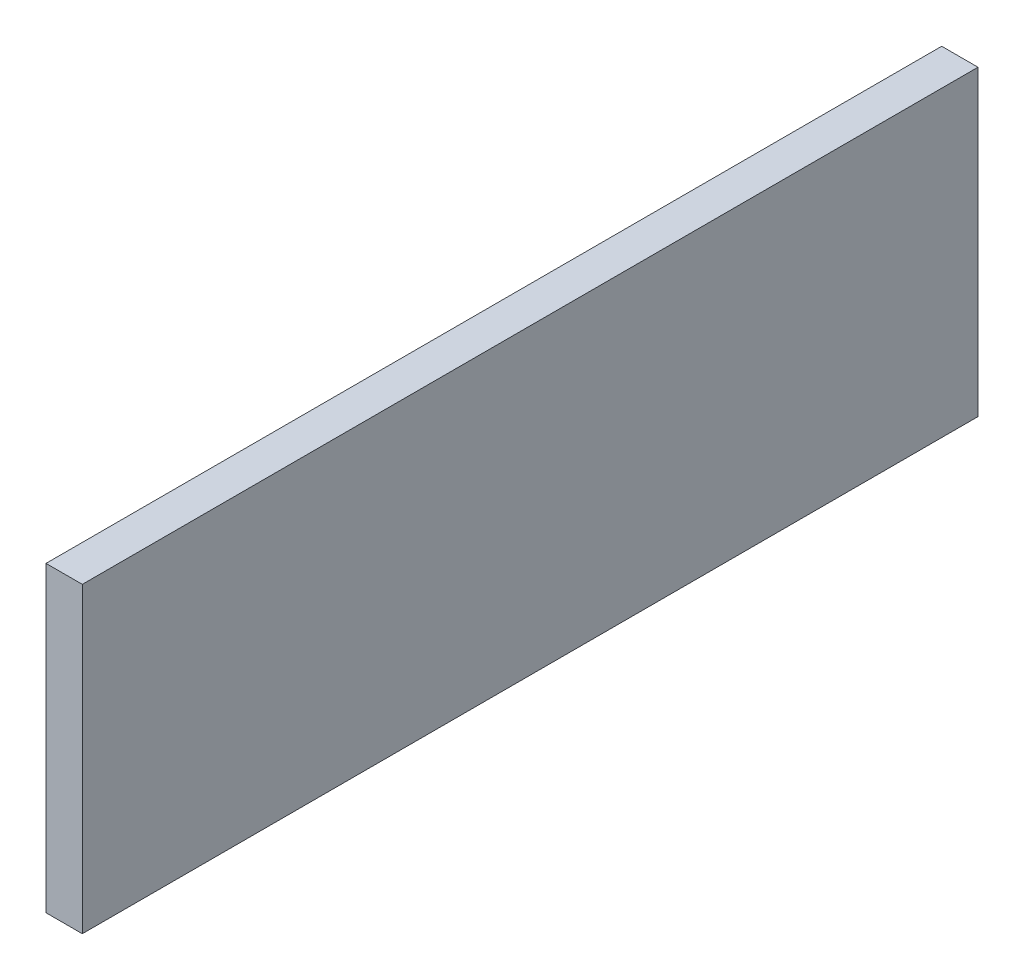
ISO-10303-21;
HEADER;
FILE_DESCRIPTION(('STEP AP214'),'2;1');
FILE_NAME('part.step','',(''),(''),'','','');
FILE_SCHEMA(('AUTOMOTIVE_DESIGN { 1 0 10303 214 1 1 1 1 }'));
ENDSEC;
DATA;
#1=APPLICATION_CONTEXT('core data for automotive mechanical design processes');
#2=APPLICATION_PROTOCOL_DEFINITION('international standard','automotive_design',2000,#1);
#3=PRODUCT_CONTEXT('',#1,'mechanical');
#4=PRODUCT('Part','Part','',(#3));
#5=PRODUCT_RELATED_PRODUCT_CATEGORY('part','',(#4));
#6=PRODUCT_DEFINITION_FORMATION('','',#4);
#7=PRODUCT_DEFINITION_CONTEXT('part definition',#1,'design');
#8=PRODUCT_DEFINITION('design','',#6,#7);
#9=PRODUCT_DEFINITION_SHAPE('','',#8);
#10=(LENGTH_UNIT() NAMED_UNIT(*) SI_UNIT(.MILLI.,.METRE.));
#11=(NAMED_UNIT(*) PLANE_ANGLE_UNIT() SI_UNIT($,.RADIAN.));
#12=(NAMED_UNIT(*) SI_UNIT($,.STERADIAN.) SOLID_ANGLE_UNIT());
#13=UNCERTAINTY_MEASURE_WITH_UNIT(LENGTH_MEASURE(1.E-05),#10,'distance_accuracy_value','');
#14=(GEOMETRIC_REPRESENTATION_CONTEXT(3) GLOBAL_UNCERTAINTY_ASSIGNED_CONTEXT((#13)) GLOBAL_UNIT_ASSIGNED_CONTEXT((#10,
#11,#12)) REPRESENTATION_CONTEXT('',''));
#15=CARTESIAN_POINT('',(0.,0.,0.));
#16=DIRECTION('',(0.,0.,1.));
#17=DIRECTION('',(1.,0.,0.));
#18=AXIS2_PLACEMENT_3D('',#15,#16,#17);
#19=CARTESIAN_POINT('',(1518.99999242226,1250.,-460.));
#20=DIRECTION('',(0.,-1.,0.));
#21=DIRECTION('',(0.,0.,-1.));
#22=AXIS2_PLACEMENT_3D('',#19,#20,#21);
#23=PLANE('',#22);
#24=DIRECTION('',(0.,0.,1.));
#25=VECTOR('',#24,1.);
#26=CARTESIAN_POINT('',(1488.99999242226,1250.,-460.));
#27=LINE('',#26,#25);
#28=CARTESIAN_POINT('',(1488.99999242226,1250.,-460.));
#29=VERTEX_POINT('',#28);
#30=CARTESIAN_POINT('',(1488.99999242226,1250.,280.));
#31=VERTEX_POINT('',#30);
#32=EDGE_CURVE('E61',#29,#31,#27,.T.);
#33=ORIENTED_EDGE('',*,*,#32,.T.);
#34=DIRECTION('',(-1.,0.,0.));
#35=VECTOR('',#34,1.);
#36=CARTESIAN_POINT('',(1518.99999242226,1250.,280.));
#37=LINE('',#36,#35);
#38=CARTESIAN_POINT('',(1518.99999242226,1250.,280.));
#39=VERTEX_POINT('',#38);
#40=EDGE_CURVE('E11',#39,#31,#37,.T.);
#41=ORIENTED_EDGE('',*,*,#40,.F.);
#42=DIRECTION('',(0.,0.,1.));
#43=VECTOR('',#42,1.);
#44=CARTESIAN_POINT('',(1518.99999242226,1250.,-460.));
#45=LINE('',#44,#43);
#46=CARTESIAN_POINT('',(1518.99999242226,1250.,-460.));
#47=VERTEX_POINT('',#46);
#48=EDGE_CURVE('E80',#47,#39,#45,.T.);
#49=ORIENTED_EDGE('',*,*,#48,.F.);
#50=DIRECTION('',(-1.,0.,0.));
#51=VECTOR('',#50,1.);
#52=CARTESIAN_POINT('',(1518.99999242226,1250.,-460.));
#53=LINE('',#52,#51);
#54=EDGE_CURVE('E73',#47,#29,#53,.T.);
#55=ORIENTED_EDGE('',*,*,#54,.T.);
#56=EDGE_LOOP('',(#33,#41,#49,#55));
#57=FACE_BOUND('',#56,.T.);
#58=ADVANCED_FACE('F17',(#57),#23,.F.);
#59=CARTESIAN_POINT('',(1518.99999242226,1250.,280.));
#60=DIRECTION('',(0.,0.,-1.));
#61=DIRECTION('',(0.,1.,0.));
#62=AXIS2_PLACEMENT_3D('',#59,#60,#61);
#63=PLANE('',#62);
#64=DIRECTION('',(0.,-1.,0.));
#65=VECTOR('',#64,1.);
#66=CARTESIAN_POINT('',(1488.99999242226,1250.,280.));
#67=LINE('',#66,#65);
#68=CARTESIAN_POINT('',(1488.99999242226,1000.,280.));
#69=VERTEX_POINT('',#68);
#70=EDGE_CURVE('E57',#31,#69,#67,.T.);
#71=ORIENTED_EDGE('',*,*,#70,.T.);
#72=DIRECTION('',(-1.,0.,0.));
#73=VECTOR('',#72,1.);
#74=CARTESIAN_POINT('',(1518.99999242226,1000.,280.));
#75=LINE('',#74,#73);
#76=CARTESIAN_POINT('',(1518.99999242226,1000.,280.));
#77=VERTEX_POINT('',#76);
#78=EDGE_CURVE('E24',#77,#69,#75,.T.);
#79=ORIENTED_EDGE('',*,*,#78,.F.);
#80=DIRECTION('',(0.,-1.,0.));
#81=VECTOR('',#80,1.);
#82=CARTESIAN_POINT('',(1518.99999242226,1250.,280.));
#83=LINE('',#82,#81);
#84=EDGE_CURVE('E69',#39,#77,#83,.T.);
#85=ORIENTED_EDGE('',*,*,#84,.F.);
#86=ORIENTED_EDGE('',*,*,#40,.T.);
#87=EDGE_LOOP('',(#71,#79,#85,#86));
#88=FACE_BOUND('',#87,.T.);
#89=ADVANCED_FACE('F68',(#88),#63,.F.);
#90=CARTESIAN_POINT('',(1518.99999242226,1000.,280.));
#91=DIRECTION('',(0.,1.,0.));
#92=DIRECTION('',(0.,0.,1.));
#93=AXIS2_PLACEMENT_3D('',#90,#91,#92);
#94=PLANE('',#93);
#95=DIRECTION('',(0.,0.,-1.));
#96=VECTOR('',#95,1.);
#97=CARTESIAN_POINT('',(1488.99999242226,1000.,280.));
#98=LINE('',#97,#96);
#99=CARTESIAN_POINT('',(1488.99999242226,1000.,-460.));
#100=VERTEX_POINT('',#99);
#101=EDGE_CURVE('E62',#69,#100,#98,.T.);
#102=ORIENTED_EDGE('',*,*,#101,.T.);
#103=DIRECTION('',(-1.,0.,0.));
#104=VECTOR('',#103,1.);
#105=CARTESIAN_POINT('',(1518.99999242226,1000.,-460.));
#106=LINE('',#105,#104);
#107=CARTESIAN_POINT('',(1518.99999242226,1000.,-460.));
#108=VERTEX_POINT('',#107);
#109=EDGE_CURVE('E85',#108,#100,#106,.T.);
#110=ORIENTED_EDGE('',*,*,#109,.F.);
#111=DIRECTION('',(0.,0.,-1.));
#112=VECTOR('',#111,1.);
#113=CARTESIAN_POINT('',(1518.99999242226,1000.,280.));
#114=LINE('',#113,#112);
#115=EDGE_CURVE('E36',#77,#108,#114,.T.);
#116=ORIENTED_EDGE('',*,*,#115,.F.);
#117=ORIENTED_EDGE('',*,*,#78,.T.);
#118=EDGE_LOOP('',(#102,#110,#116,#117));
#119=FACE_BOUND('',#118,.T.);
#120=ADVANCED_FACE('F88',(#119),#94,.F.);
#121=CARTESIAN_POINT('',(1518.99999242226,1000.,-460.));
#122=DIRECTION('',(0.,0.,1.));
#123=DIRECTION('',(0.,-1.,0.));
#124=AXIS2_PLACEMENT_3D('',#121,#122,#123);
#125=PLANE('',#124);
#126=DIRECTION('',(0.,1.,0.));
#127=VECTOR('',#126,1.);
#128=CARTESIAN_POINT('',(1488.99999242226,1000.,-460.));
#129=LINE('',#128,#127);
#130=EDGE_CURVE('E77',#100,#29,#129,.T.);
#131=ORIENTED_EDGE('',*,*,#130,.T.);
#132=ORIENTED_EDGE('',*,*,#54,.F.);
#133=DIRECTION('',(0.,1.,0.));
#134=VECTOR('',#133,1.);
#135=CARTESIAN_POINT('',(1518.99999242226,1000.,-460.));
#136=LINE('',#135,#134);
#137=EDGE_CURVE('E31',#108,#47,#136,.T.);
#138=ORIENTED_EDGE('',*,*,#137,.F.);
#139=ORIENTED_EDGE('',*,*,#109,.T.);
#140=EDGE_LOOP('',(#131,#132,#138,#139));
#141=FACE_BOUND('',#140,.T.);
#142=ADVANCED_FACE('F90',(#141),#125,.F.);
#143=CARTESIAN_POINT('',(1518.99999242226,1250.,-460.));
#144=DIRECTION('',(-1.,0.,0.));
#145=DIRECTION('',(0.,-1.,0.));
#146=AXIS2_PLACEMENT_3D('',#143,#144,#145);
#147=PLANE('',#146);
#148=ORIENTED_EDGE('',*,*,#48,.T.);
#149=ORIENTED_EDGE('',*,*,#84,.T.);
#150=ORIENTED_EDGE('',*,*,#115,.T.);
#151=ORIENTED_EDGE('',*,*,#137,.T.);
#152=EDGE_LOOP('',(#148,#149,#150,#151));
#153=FACE_BOUND('',#152,.T.);
#154=ADVANCED_FACE('F91',(#153),#147,.F.);
#155=CARTESIAN_POINT('',(1488.99999242226,1250.,-460.));
#156=DIRECTION('',(-1.,0.,0.));
#157=DIRECTION('',(0.,-1.,0.));
#158=AXIS2_PLACEMENT_3D('',#155,#156,#157);
#159=PLANE('',#158);
#160=ORIENTED_EDGE('',*,*,#32,.F.);
#161=ORIENTED_EDGE('',*,*,#130,.F.);
#162=ORIENTED_EDGE('',*,*,#101,.F.);
#163=ORIENTED_EDGE('',*,*,#70,.F.);
#164=EDGE_LOOP('',(#160,#161,#162,#163));
#165=FACE_BOUND('',#164,.T.);
#166=ADVANCED_FACE('F58',(#165),#159,.T.);
#167=CLOSED_SHELL('',(#58,#89,#120,#142,#154,#166));
#168=MANIFOLD_SOLID_BREP('B1',#167);
#169=ADVANCED_BREP_SHAPE_REPRESENTATION('',(#18,#168),#14);
#170=SHAPE_DEFINITION_REPRESENTATION(#9,#169);
ENDSEC;
END-ISO-10303-21;
